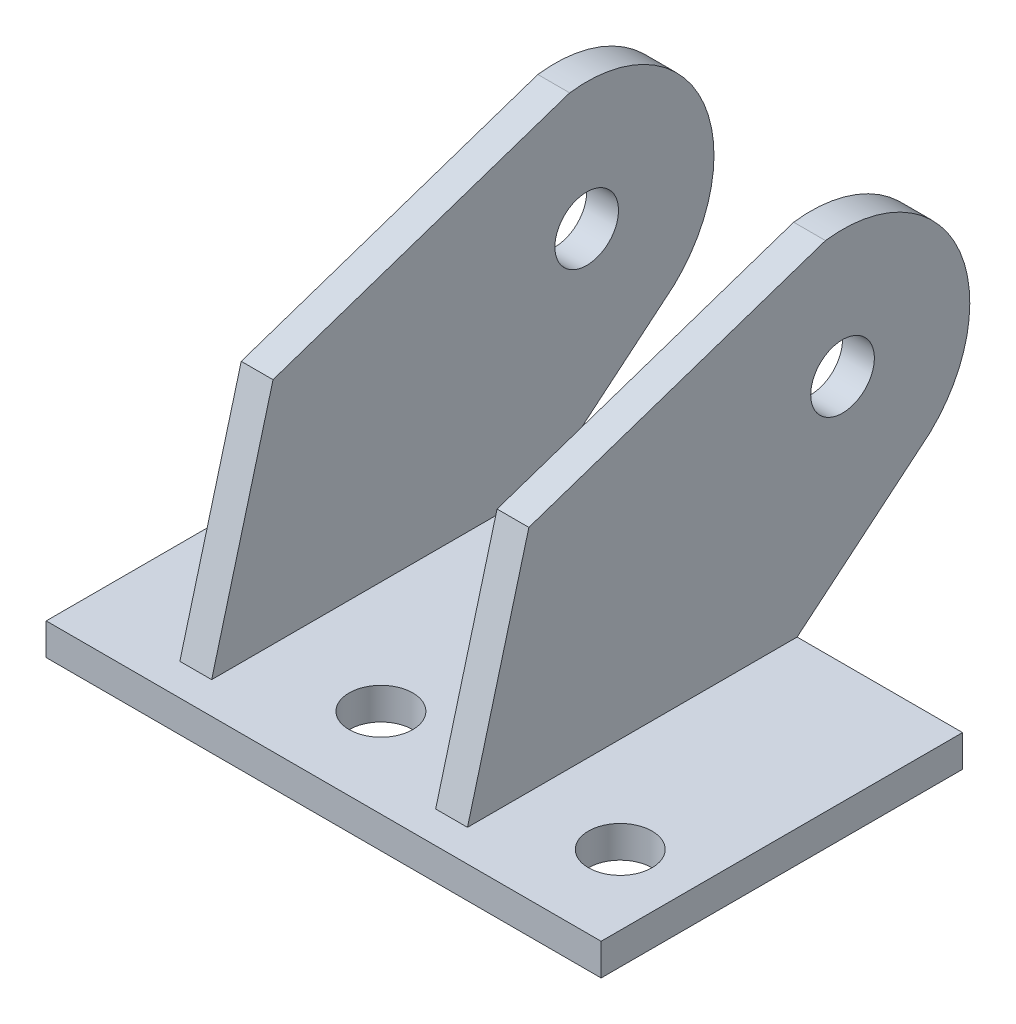
ISO-10303-21;
HEADER;
FILE_DESCRIPTION(('STEP AP214'),'2;1');
FILE_NAME('part.step','',(''),(''),'','','');
FILE_SCHEMA(('AUTOMOTIVE_DESIGN { 1 0 10303 214 1 1 1 1 }'));
ENDSEC;
DATA;
#1=APPLICATION_CONTEXT('core data for automotive mechanical design processes');
#2=APPLICATION_PROTOCOL_DEFINITION('international standard','automotive_design',2000,#1);
#3=PRODUCT_CONTEXT('',#1,'mechanical');
#4=PRODUCT('Part','Part','',(#3));
#5=PRODUCT_RELATED_PRODUCT_CATEGORY('part','',(#4));
#6=PRODUCT_DEFINITION_FORMATION('','',#4);
#7=PRODUCT_DEFINITION_CONTEXT('part definition',#1,'design');
#8=PRODUCT_DEFINITION('design','',#6,#7);
#9=PRODUCT_DEFINITION_SHAPE('','',#8);
#10=(LENGTH_UNIT() NAMED_UNIT(*) SI_UNIT(.MILLI.,.METRE.));
#11=(NAMED_UNIT(*) PLANE_ANGLE_UNIT() SI_UNIT($,.RADIAN.));
#12=(NAMED_UNIT(*) SI_UNIT($,.STERADIAN.) SOLID_ANGLE_UNIT());
#13=UNCERTAINTY_MEASURE_WITH_UNIT(LENGTH_MEASURE(1.E-05),#10,'distance_accuracy_value','');
#14=(GEOMETRIC_REPRESENTATION_CONTEXT(3) GLOBAL_UNCERTAINTY_ASSIGNED_CONTEXT((#13)) GLOBAL_UNIT_ASSIGNED_CONTEXT((#10,
#11,#12)) REPRESENTATION_CONTEXT('',''));
#15=CARTESIAN_POINT('',(0.,0.,0.));
#16=DIRECTION('',(0.,0.,1.));
#17=DIRECTION('',(1.,0.,0.));
#18=AXIS2_PLACEMENT_3D('',#15,#16,#17);
#19=CARTESIAN_POINT('',(0.,3.175,0.));
#20=DIRECTION('',(0.,-1.,0.));
#21=DIRECTION('',(0.,0.,-1.));
#22=AXIS2_PLACEMENT_3D('',#19,#20,#21);
#23=PLANE('',#22);
#24=DIRECTION('',(0.,0.,-1.));
#25=VECTOR('',#24,1.);
#26=CARTESIAN_POINT('',(55.372,3.175,0.));
#27=LINE('',#26,#25);
#28=CARTESIAN_POINT('',(55.372,3.175,0.));
#29=VERTEX_POINT('',#28);
#30=CARTESIAN_POINT('',(55.372,3.175,-36.068));
#31=VERTEX_POINT('',#30);
#32=EDGE_CURVE('E223',#29,#31,#27,.T.);
#33=ORIENTED_EDGE('',*,*,#32,.T.);
#34=DIRECTION('',(-1.,0.,0.));
#35=VECTOR('',#34,1.);
#36=CARTESIAN_POINT('',(0.,3.175,-36.068));
#37=LINE('',#36,#35);
#38=CARTESIAN_POINT('',(38.862,3.175,-36.068));
#39=VERTEX_POINT('',#38);
#40=EDGE_CURVE('E226',#31,#39,#37,.T.);
#41=ORIENTED_EDGE('',*,*,#40,.T.);
#42=DIRECTION('',(0.,0.,-1.));
#43=VECTOR('',#42,1.);
#44=CARTESIAN_POINT('',(38.862,3.175,-3.175));
#45=LINE('',#44,#43);
#46=CARTESIAN_POINT('',(38.862,3.175,-3.175));
#47=VERTEX_POINT('',#46);
#48=EDGE_CURVE('E306',#47,#39,#45,.T.);
#49=ORIENTED_EDGE('',*,*,#48,.F.);
#50=DIRECTION('',(1.,0.,0.));
#51=VECTOR('',#50,1.);
#52=CARTESIAN_POINT('',(35.687,3.175,-3.175));
#53=LINE('',#52,#51);
#54=CARTESIAN_POINT('',(35.687,3.175,-3.175));
#55=VERTEX_POINT('',#54);
#56=EDGE_CURVE('E308',#55,#47,#53,.T.);
#57=ORIENTED_EDGE('',*,*,#56,.F.);
#58=DIRECTION('',(0.,0.,1.));
#59=VECTOR('',#58,1.);
#60=CARTESIAN_POINT('',(35.687,3.175,-3.175));
#61=LINE('',#60,#59);
#62=CARTESIAN_POINT('',(35.687,3.175,-36.068));
#63=VERTEX_POINT('',#62);
#64=EDGE_CURVE('E170',#63,#55,#61,.T.);
#65=ORIENTED_EDGE('',*,*,#64,.F.);
#66=CARTESIAN_POINT('',(13.335,3.175,-36.068));
#67=VERTEX_POINT('',#66);
#68=EDGE_CURVE('E231',#63,#67,#37,.T.);
#69=ORIENTED_EDGE('',*,*,#68,.T.);
#70=DIRECTION('',(0.,0.,-1.));
#71=VECTOR('',#70,1.);
#72=CARTESIAN_POINT('',(13.335,3.175,-3.175));
#73=LINE('',#72,#71);
#74=CARTESIAN_POINT('',(13.335,3.175,-3.175));
#75=VERTEX_POINT('',#74);
#76=EDGE_CURVE('E169',#75,#67,#73,.T.);
#77=ORIENTED_EDGE('',*,*,#76,.F.);
#78=DIRECTION('',(1.,0.,0.));
#79=VECTOR('',#78,1.);
#80=CARTESIAN_POINT('',(10.16,3.175,-3.175));
#81=LINE('',#80,#79);
#82=CARTESIAN_POINT('',(10.16,3.175,-3.175));
#83=VERTEX_POINT('',#82);
#84=EDGE_CURVE('E152',#83,#75,#81,.T.);
#85=ORIENTED_EDGE('',*,*,#84,.F.);
#86=DIRECTION('',(0.,0.,1.));
#87=VECTOR('',#86,1.);
#88=CARTESIAN_POINT('',(10.16,3.175,-3.175));
#89=LINE('',#88,#87);
#90=CARTESIAN_POINT('',(10.16,3.175,-36.068));
#91=VERTEX_POINT('',#90);
#92=EDGE_CURVE('E166',#91,#83,#89,.T.);
#93=ORIENTED_EDGE('',*,*,#92,.F.);
#94=CARTESIAN_POINT('',(0.,3.175,-36.068));
#95=VERTEX_POINT('',#94);
#96=EDGE_CURVE('E225',#91,#95,#37,.T.);
#97=ORIENTED_EDGE('',*,*,#96,.T.);
#98=DIRECTION('',(0.,0.,1.));
#99=VECTOR('',#98,1.);
#100=CARTESIAN_POINT('',(0.,3.175,0.));
#101=LINE('',#100,#99);
#102=CARTESIAN_POINT('',(0.,3.175,0.));
#103=VERTEX_POINT('',#102);
#104=EDGE_CURVE('E216',#95,#103,#101,.T.);
#105=ORIENTED_EDGE('',*,*,#104,.T.);
#106=DIRECTION('',(1.,0.,0.));
#107=VECTOR('',#106,1.);
#108=CARTESIAN_POINT('',(0.,3.175,0.));
#109=LINE('',#108,#107);
#110=EDGE_CURVE('E219',#103,#29,#109,.T.);
#111=ORIENTED_EDGE('',*,*,#110,.T.);
#112=EDGE_LOOP('',(#33,#41,#49,#57,#65,#69,#77,#85,#93,#97,#105,#111));
#113=FACE_BOUND('',#112,.T.);
#114=CARTESIAN_POINT('',(24.511,3.175,-26.162));
#115=DIRECTION('',(0.,1.,0.));
#116=DIRECTION('',(0.,0.,1.));
#117=AXIS2_PLACEMENT_3D('',#114,#115,#116);
#118=CIRCLE('',#117,3.175);
#119=CARTESIAN_POINT('',(24.511,3.175,-22.987));
#120=VERTEX_POINT('',#119);
#121=EDGE_CURVE('E200',#120,#120,#118,.T.);
#122=ORIENTED_EDGE('',*,*,#121,.F.);
#123=EDGE_LOOP('',(#122));
#124=FACE_BOUND('',#123,.T.);
#125=CARTESIAN_POINT('',(24.511,3.175,-8.89));
#126=DIRECTION('',(0.,1.,0.));
#127=DIRECTION('',(0.,0.,1.));
#128=AXIS2_PLACEMENT_3D('',#125,#126,#127);
#129=CIRCLE('',#128,3.175);
#130=CARTESIAN_POINT('',(24.511,3.175,-5.715));
#131=VERTEX_POINT('',#130);
#132=EDGE_CURVE('E208',#131,#131,#129,.T.);
#133=ORIENTED_EDGE('',*,*,#132,.F.);
#134=EDGE_LOOP('',(#133));
#135=FACE_BOUND('',#134,.T.);
#136=CARTESIAN_POINT('',(48.387,3.175,-8.89));
#137=DIRECTION('',(0.,1.,0.));
#138=DIRECTION('',(0.,0.,1.));
#139=AXIS2_PLACEMENT_3D('',#136,#137,#138);
#140=CIRCLE('',#139,3.175);
#141=CARTESIAN_POINT('',(48.387,3.175,-5.715));
#142=VERTEX_POINT('',#141);
#143=EDGE_CURVE('E190',#142,#142,#140,.T.);
#144=ORIENTED_EDGE('',*,*,#143,.F.);
#145=EDGE_LOOP('',(#144));
#146=FACE_BOUND('',#145,.T.);
#147=ADVANCED_FACE('F48',(#113,#124,#135,#146),#23,.F.);
#148=CARTESIAN_POINT('',(0.,0.,0.));
#149=DIRECTION('',(0.,-1.,0.));
#150=DIRECTION('',(0.,0.,-1.));
#151=AXIS2_PLACEMENT_3D('',#148,#149,#150);
#152=PLANE('',#151);
#153=CARTESIAN_POINT('',(24.511,0.,-26.162));
#154=DIRECTION('',(0.,1.,0.));
#155=DIRECTION('',(0.,0.,1.));
#156=AXIS2_PLACEMENT_3D('',#153,#154,#155);
#157=CIRCLE('',#156,3.175);
#158=CARTESIAN_POINT('',(24.511,0.,-22.987));
#159=VERTEX_POINT('',#158);
#160=EDGE_CURVE('E195',#159,#159,#157,.T.);
#161=ORIENTED_EDGE('',*,*,#160,.T.);
#162=EDGE_LOOP('',(#161));
#163=FACE_BOUND('',#162,.T.);
#164=DIRECTION('',(0.,0.,1.));
#165=VECTOR('',#164,1.);
#166=CARTESIAN_POINT('',(0.,0.,0.));
#167=LINE('',#166,#165);
#168=CARTESIAN_POINT('',(0.,0.,-36.068));
#169=VERTEX_POINT('',#168);
#170=CARTESIAN_POINT('',(0.,0.,0.));
#171=VERTEX_POINT('',#170);
#172=EDGE_CURVE('E213',#169,#171,#167,.T.);
#173=ORIENTED_EDGE('',*,*,#172,.F.);
#174=DIRECTION('',(-1.,0.,0.));
#175=VECTOR('',#174,1.);
#176=CARTESIAN_POINT('',(0.,0.,-36.068));
#177=LINE('',#176,#175);
#178=CARTESIAN_POINT('',(55.372,0.,-36.068));
#179=VERTEX_POINT('',#178);
#180=EDGE_CURVE('E220',#179,#169,#177,.T.);
#181=ORIENTED_EDGE('',*,*,#180,.F.);
#182=DIRECTION('',(0.,0.,-1.));
#183=VECTOR('',#182,1.);
#184=CARTESIAN_POINT('',(55.372,0.,0.));
#185=LINE('',#184,#183);
#186=CARTESIAN_POINT('',(55.372,0.,0.));
#187=VERTEX_POINT('',#186);
#188=EDGE_CURVE('E237',#187,#179,#185,.T.);
#189=ORIENTED_EDGE('',*,*,#188,.F.);
#190=DIRECTION('',(1.,0.,0.));
#191=VECTOR('',#190,1.);
#192=CARTESIAN_POINT('',(0.,0.,0.));
#193=LINE('',#192,#191);
#194=EDGE_CURVE('E235',#171,#187,#193,.T.);
#195=ORIENTED_EDGE('',*,*,#194,.F.);
#196=EDGE_LOOP('',(#173,#181,#189,#195));
#197=FACE_BOUND('',#196,.T.);
#198=CARTESIAN_POINT('',(24.511,0.,-8.89));
#199=DIRECTION('',(0.,1.,0.));
#200=DIRECTION('',(0.,0.,1.));
#201=AXIS2_PLACEMENT_3D('',#198,#199,#200);
#202=CIRCLE('',#201,3.175);
#203=CARTESIAN_POINT('',(24.511,0.,-5.715));
#204=VERTEX_POINT('',#203);
#205=EDGE_CURVE('E204',#204,#204,#202,.T.);
#206=ORIENTED_EDGE('',*,*,#205,.T.);
#207=EDGE_LOOP('',(#206));
#208=FACE_BOUND('',#207,.T.);
#209=CARTESIAN_POINT('',(48.387,0.,-8.89));
#210=DIRECTION('',(0.,1.,0.));
#211=DIRECTION('',(0.,0.,1.));
#212=AXIS2_PLACEMENT_3D('',#209,#210,#211);
#213=CIRCLE('',#212,3.175);
#214=CARTESIAN_POINT('',(48.387,0.,-5.715));
#215=VERTEX_POINT('',#214);
#216=EDGE_CURVE('E189',#215,#215,#213,.T.);
#217=ORIENTED_EDGE('',*,*,#216,.T.);
#218=EDGE_LOOP('',(#217));
#219=FACE_BOUND('',#218,.T.);
#220=ADVANCED_FACE('F345',(#163,#197,#208,#219),#152,.T.);
#221=CARTESIAN_POINT('',(0.,3.175,0.));
#222=DIRECTION('',(1.,0.,0.));
#223=DIRECTION('',(0.,0.,-1.));
#224=AXIS2_PLACEMENT_3D('',#221,#222,#223);
#225=PLANE('',#224);
#226=ORIENTED_EDGE('',*,*,#172,.T.);
#227=DIRECTION('',(0.,-1.,0.));
#228=VECTOR('',#227,1.);
#229=CARTESIAN_POINT('',(0.,3.175,0.));
#230=LINE('',#229,#228);
#231=EDGE_CURVE('E177',#103,#171,#230,.T.);
#232=ORIENTED_EDGE('',*,*,#231,.F.);
#233=ORIENTED_EDGE('',*,*,#104,.F.);
#234=DIRECTION('',(0.,-1.,0.));
#235=VECTOR('',#234,1.);
#236=CARTESIAN_POINT('',(0.,3.175,-36.068));
#237=LINE('',#236,#235);
#238=EDGE_CURVE('E229',#95,#169,#237,.T.);
#239=ORIENTED_EDGE('',*,*,#238,.T.);
#240=EDGE_LOOP('',(#226,#232,#233,#239));
#241=FACE_BOUND('',#240,.T.);
#242=ADVANCED_FACE('F50',(#241),#225,.F.);
#243=CARTESIAN_POINT('',(0.,3.175,0.));
#244=DIRECTION('',(0.,0.,-1.));
#245=DIRECTION('',(-1.,0.,0.));
#246=AXIS2_PLACEMENT_3D('',#243,#244,#245);
#247=PLANE('',#246);
#248=ORIENTED_EDGE('',*,*,#194,.T.);
#249=DIRECTION('',(0.,-1.,0.));
#250=VECTOR('',#249,1.);
#251=CARTESIAN_POINT('',(55.372,3.175,0.));
#252=LINE('',#251,#250);
#253=EDGE_CURVE('E183',#29,#187,#252,.T.);
#254=ORIENTED_EDGE('',*,*,#253,.F.);
#255=ORIENTED_EDGE('',*,*,#110,.F.);
#256=ORIENTED_EDGE('',*,*,#231,.T.);
#257=EDGE_LOOP('',(#248,#254,#255,#256));
#258=FACE_BOUND('',#257,.T.);
#259=ADVANCED_FACE('F361',(#258),#247,.F.);
#260=CARTESIAN_POINT('',(55.372,3.175,0.));
#261=DIRECTION('',(-1.,0.,0.));
#262=DIRECTION('',(0.,0.,1.));
#263=AXIS2_PLACEMENT_3D('',#260,#261,#262);
#264=PLANE('',#263);
#265=ORIENTED_EDGE('',*,*,#188,.T.);
#266=DIRECTION('',(0.,-1.,0.));
#267=VECTOR('',#266,1.);
#268=CARTESIAN_POINT('',(55.372,3.175,-36.068));
#269=LINE('',#268,#267);
#270=EDGE_CURVE('E242',#31,#179,#269,.T.);
#271=ORIENTED_EDGE('',*,*,#270,.F.);
#272=ORIENTED_EDGE('',*,*,#32,.F.);
#273=ORIENTED_EDGE('',*,*,#253,.T.);
#274=EDGE_LOOP('',(#265,#271,#272,#273));
#275=FACE_BOUND('',#274,.T.);
#276=ADVANCED_FACE('F360',(#275),#264,.F.);
#277=CARTESIAN_POINT('',(0.,3.175,-36.068));
#278=DIRECTION('',(0.,0.,1.));
#279=DIRECTION('',(1.,0.,0.));
#280=AXIS2_PLACEMENT_3D('',#277,#278,#279);
#281=PLANE('',#280);
#282=ORIENTED_EDGE('',*,*,#180,.T.);
#283=ORIENTED_EDGE('',*,*,#238,.F.);
#284=ORIENTED_EDGE('',*,*,#96,.F.);
#285=EDGE_CURVE('E232',#67,#91,#37,.T.);
#286=ORIENTED_EDGE('',*,*,#285,.F.);
#287=ORIENTED_EDGE('',*,*,#68,.F.);
#288=EDGE_CURVE('E230',#39,#63,#37,.T.);
#289=ORIENTED_EDGE('',*,*,#288,.F.);
#290=ORIENTED_EDGE('',*,*,#40,.F.);
#291=ORIENTED_EDGE('',*,*,#270,.T.);
#292=EDGE_LOOP('',(#282,#283,#284,#286,#287,#289,#290,#291));
#293=FACE_BOUND('',#292,.T.);
#294=ADVANCED_FACE('F321',(#293),#281,.F.);
#295=CARTESIAN_POINT('',(24.511,3.175,-8.89));
#296=DIRECTION('',(0.,-1.,0.));
#297=DIRECTION('',(0.,0.,-1.));
#298=AXIS2_PLACEMENT_3D('',#295,#296,#297);
#299=CYLINDRICAL_SURFACE('',#298,3.175);
#300=ORIENTED_EDGE('',*,*,#132,.T.);
#301=EDGE_LOOP('',(#300));
#302=FACE_BOUND('',#301,.T.);
#303=ORIENTED_EDGE('',*,*,#205,.F.);
#304=EDGE_LOOP('',(#303));
#305=FACE_BOUND('',#304,.T.);
#306=ADVANCED_FACE('F355',(#302,#305),#299,.F.);
#307=CARTESIAN_POINT('',(24.511,3.175,-26.162));
#308=DIRECTION('',(0.,-1.,0.));
#309=DIRECTION('',(0.,0.,-1.));
#310=AXIS2_PLACEMENT_3D('',#307,#308,#309);
#311=CYLINDRICAL_SURFACE('',#310,3.175);
#312=ORIENTED_EDGE('',*,*,#121,.T.);
#313=EDGE_LOOP('',(#312));
#314=FACE_BOUND('',#313,.T.);
#315=ORIENTED_EDGE('',*,*,#160,.F.);
#316=EDGE_LOOP('',(#315));
#317=FACE_BOUND('',#316,.T.);
#318=ADVANCED_FACE('F387',(#314,#317),#311,.F.);
#319=CARTESIAN_POINT('',(48.387,3.175,-8.89));
#320=DIRECTION('',(0.,-1.,0.));
#321=DIRECTION('',(0.,0.,-1.));
#322=AXIS2_PLACEMENT_3D('',#319,#320,#321);
#323=CYLINDRICAL_SURFACE('',#322,3.175);
#324=ORIENTED_EDGE('',*,*,#143,.T.);
#325=EDGE_LOOP('',(#324));
#326=FACE_BOUND('',#325,.T.);
#327=ORIENTED_EDGE('',*,*,#216,.F.);
#328=EDGE_LOOP('',(#327));
#329=FACE_BOUND('',#328,.T.);
#330=ADVANCED_FACE('F385',(#326,#329),#323,.F.);
#331=CARTESIAN_POINT('',(10.16,41.275,-3.175));
#332=DIRECTION('',(1.,0.,0.));
#333=DIRECTION('',(0.,0.,-1.));
#334=AXIS2_PLACEMENT_3D('',#331,#332,#333);
#335=PLANE('',#334);
#336=CARTESIAN_POINT('',(10.16,23.4355448586214,-40.5975082426515));
#337=DIRECTION('',(-1.,0.,0.));
#338=DIRECTION('',(0.,0.,1.));
#339=AXIS2_PLACEMENT_3D('',#336,#337,#338);
#340=CIRCLE('',#339,3.175);
#341=CARTESIAN_POINT('',(10.16,23.4355448586214,-37.4225082426515));
#342=VERTEX_POINT('',#341);
#343=EDGE_CURVE('E294',#342,#342,#340,.T.);
#344=ORIENTED_EDGE('',*,*,#343,.F.);
#345=EDGE_LOOP('',(#344));
#346=FACE_BOUND('',#345,.T.);
#347=ORIENTED_EDGE('',*,*,#92,.T.);
#348=DIRECTION('',(0.,-0.965925826289068,0.258819045102522));
#349=VECTOR('',#348,1.);
#350=CARTESIAN_POINT('',(10.16,3.175,-3.175));
#351=LINE('',#350,#349);
#352=CARTESIAN_POINT('',(10.16,26.035,-9.30031853897549));
#353=VERTEX_POINT('',#352);
#354=EDGE_CURVE('E149',#353,#83,#351,.T.);
#355=ORIENTED_EDGE('',*,*,#354,.F.);
#356=DIRECTION('',(0.,-0.319693709258279,0.947520940275561));
#357=VECTOR('',#356,1.);
#358=CARTESIAN_POINT('',(10.16,26.035,-9.30031853897549));
#359=LINE('',#358,#357);
#360=CARTESIAN_POINT('',(10.16,36.0213542971487,-38.8982728919485));
#361=VERTEX_POINT('',#360);
#362=EDGE_CURVE('E274',#361,#353,#359,.T.);
#363=ORIENTED_EDGE('',*,*,#362,.F.);
#364=CARTESIAN_POINT('',(10.16,23.4355448586214,-40.5975082426515));
#365=DIRECTION('',(1.,0.,0.));
#366=DIRECTION('',(0.,0.,1.));
#367=AXIS2_PLACEMENT_3D('',#364,#365,#366);
#368=CIRCLE('',#367,12.7);
#369=CARTESIAN_POINT('',(10.16,14.2257191361848,-49.3421700521411));
#370=VERTEX_POINT('',#369);
#371=EDGE_CURVE('E330',#370,#361,#368,.T.);
#372=ORIENTED_EDGE('',*,*,#371,.F.);
#373=DIRECTION('',(0.,0.639805415480825,-0.768536941416227));
#374=VECTOR('',#373,1.);
#375=CARTESIAN_POINT('',(10.16,3.175,-36.068));
#376=LINE('',#375,#374);
#377=EDGE_CURVE('E160',#91,#370,#376,.T.);
#378=ORIENTED_EDGE('',*,*,#377,.F.);
#379=EDGE_LOOP('',(#347,#355,#363,#372,#378));
#380=FACE_BOUND('',#379,.T.);
#381=ADVANCED_FACE('F173',(#346,#380),#335,.F.);
#382=CARTESIAN_POINT('',(13.335,41.275,-3.175));
#383=DIRECTION('',(-1.,0.,0.));
#384=DIRECTION('',(0.,0.,1.));
#385=AXIS2_PLACEMENT_3D('',#382,#383,#384);
#386=PLANE('',#385);
#387=CARTESIAN_POINT('',(13.335,23.4355448586214,-40.5975082426515));
#388=DIRECTION('',(-1.,0.,0.));
#389=DIRECTION('',(0.,0.,1.));
#390=AXIS2_PLACEMENT_3D('',#387,#388,#389);
#391=CIRCLE('',#390,3.175);
#392=CARTESIAN_POINT('',(13.335,23.4355448586214,-37.4225082426515));
#393=VERTEX_POINT('',#392);
#394=EDGE_CURVE('E303',#393,#393,#391,.T.);
#395=ORIENTED_EDGE('',*,*,#394,.T.);
#396=EDGE_LOOP('',(#395));
#397=FACE_BOUND('',#396,.T.);
#398=DIRECTION('',(0.,-0.31969370925828,0.947520940275561));
#399=VECTOR('',#398,1.);
#400=CARTESIAN_POINT('',(13.335,25.7371300371616,-8.41747968699033));
#401=LINE('',#400,#399);
#402=CARTESIAN_POINT('',(13.335,36.0213542971487,-38.8982728919485));
#403=VERTEX_POINT('',#402);
#404=CARTESIAN_POINT('',(13.335,26.035,-9.30031853897549));
#405=VERTEX_POINT('',#404);
#406=EDGE_CURVE('E286',#403,#405,#401,.T.);
#407=ORIENTED_EDGE('',*,*,#406,.T.);
#408=DIRECTION('',(0.,-0.965925826289068,0.258819045102522));
#409=VECTOR('',#408,1.);
#410=CARTESIAN_POINT('',(13.335,38.7227839420935,-12.7));
#411=LINE('',#410,#409);
#412=EDGE_CURVE('E292',#405,#75,#411,.T.);
#413=ORIENTED_EDGE('',*,*,#412,.T.);
#414=ORIENTED_EDGE('',*,*,#76,.T.);
#415=DIRECTION('',(0.,0.639805415480825,-0.768536941416227));
#416=VECTOR('',#415,1.);
#417=CARTESIAN_POINT('',(13.335,2.59732014834499,-35.3740885457259));
#418=LINE('',#417,#416);
#419=CARTESIAN_POINT('',(13.335,14.2257191361848,-49.3421700521411));
#420=VERTEX_POINT('',#419);
#421=EDGE_CURVE('E71',#67,#420,#418,.T.);
#422=ORIENTED_EDGE('',*,*,#421,.T.);
#423=CARTESIAN_POINT('',(13.335,23.4355448586214,-40.5975082426515));
#424=DIRECTION('',(-1.,0.,0.));
#425=DIRECTION('',(0.,0.,1.));
#426=AXIS2_PLACEMENT_3D('',#423,#424,#425);
#427=CIRCLE('',#426,12.7);
#428=EDGE_CURVE('E281',#420,#403,#427,.F.);
#429=ORIENTED_EDGE('',*,*,#428,.T.);
#430=EDGE_LOOP('',(#407,#413,#414,#422,#429));
#431=FACE_BOUND('',#430,.T.);
#432=ADVANCED_FACE('F325',(#397,#431),#386,.F.);
#433=CARTESIAN_POINT('',(35.687,41.275,-3.175));
#434=DIRECTION('',(1.,0.,0.));
#435=DIRECTION('',(0.,0.,-1.));
#436=AXIS2_PLACEMENT_3D('',#433,#434,#435);
#437=PLANE('',#436);
#438=CARTESIAN_POINT('',(35.687,23.4355448586214,-40.5975082426515));
#439=DIRECTION('',(1.,0.,0.));
#440=DIRECTION('',(0.,0.,-1.));
#441=AXIS2_PLACEMENT_3D('',#438,#439,#440);
#442=CIRCLE('',#441,3.175);
#443=CARTESIAN_POINT('',(35.687,23.4355448586214,-37.4225082426515));
#444=VERTEX_POINT('',#443);
#445=EDGE_CURVE('E300',#444,#444,#442,.T.);
#446=ORIENTED_EDGE('',*,*,#445,.T.);
#447=EDGE_LOOP('',(#446));
#448=FACE_BOUND('',#447,.T.);
#449=ORIENTED_EDGE('',*,*,#64,.T.);
#450=DIRECTION('',(0.,0.965925826289068,-0.258819045102522));
#451=VECTOR('',#450,1.);
#452=CARTESIAN_POINT('',(35.687,38.7227839420935,-12.7));
#453=LINE('',#452,#451);
#454=CARTESIAN_POINT('',(35.687,26.035,-9.30031853897549));
#455=VERTEX_POINT('',#454);
#456=EDGE_CURVE('E289',#55,#455,#453,.T.);
#457=ORIENTED_EDGE('',*,*,#456,.T.);
#458=DIRECTION('',(0.,0.31969370925828,-0.947520940275561));
#459=VECTOR('',#458,1.);
#460=CARTESIAN_POINT('',(35.687,25.7371300371616,-8.41747968699033));
#461=LINE('',#460,#459);
#462=CARTESIAN_POINT('',(35.687,36.0213542971487,-38.8982728919485));
#463=VERTEX_POINT('',#462);
#464=EDGE_CURVE('E284',#455,#463,#461,.T.);
#465=ORIENTED_EDGE('',*,*,#464,.T.);
#466=CARTESIAN_POINT('',(35.687,23.4355448586214,-40.5975082426515));
#467=DIRECTION('',(1.,0.,0.));
#468=DIRECTION('',(0.,0.,-1.));
#469=AXIS2_PLACEMENT_3D('',#466,#467,#468);
#470=CIRCLE('',#469,12.7);
#471=CARTESIAN_POINT('',(35.687,14.2257191361848,-49.3421700521411));
#472=VERTEX_POINT('',#471);
#473=EDGE_CURVE('E266',#463,#472,#470,.F.);
#474=ORIENTED_EDGE('',*,*,#473,.T.);
#475=DIRECTION('',(0.,-0.639805415480825,0.768536941416227));
#476=VECTOR('',#475,1.);
#477=CARTESIAN_POINT('',(35.687,2.59732014834499,-35.3740885457259));
#478=LINE('',#477,#476);
#479=EDGE_CURVE('E275',#472,#63,#478,.T.);
#480=ORIENTED_EDGE('',*,*,#479,.T.);
#481=EDGE_LOOP('',(#449,#457,#465,#474,#480));
#482=FACE_BOUND('',#481,.T.);
#483=ADVANCED_FACE('F314',(#448,#482),#437,.F.);
#484=CARTESIAN_POINT('',(38.862,41.275,-3.175));
#485=DIRECTION('',(-1.,0.,0.));
#486=DIRECTION('',(0.,0.,1.));
#487=AXIS2_PLACEMENT_3D('',#484,#485,#486);
#488=PLANE('',#487);
#489=CARTESIAN_POINT('',(38.862,23.4355448586214,-40.5975082426515));
#490=DIRECTION('',(-1.,0.,0.));
#491=DIRECTION('',(0.,0.,1.));
#492=AXIS2_PLACEMENT_3D('',#489,#490,#491);
#493=CIRCLE('',#492,3.175);
#494=CARTESIAN_POINT('',(38.862,23.4355448586214,-37.4225082426515));
#495=VERTEX_POINT('',#494);
#496=EDGE_CURVE('E297',#495,#495,#493,.F.);
#497=ORIENTED_EDGE('',*,*,#496,.F.);
#498=EDGE_LOOP('',(#497));
#499=FACE_BOUND('',#498,.T.);
#500=DIRECTION('',(0.,-0.31969370925828,0.947520940275561));
#501=VECTOR('',#500,1.);
#502=CARTESIAN_POINT('',(38.862,25.7371300371616,-8.41747968699033));
#503=LINE('',#502,#501);
#504=CARTESIAN_POINT('',(38.862,36.0213542971487,-38.8982728919485));
#505=VERTEX_POINT('',#504);
#506=CARTESIAN_POINT('',(38.862,26.035,-9.30031853897549));
#507=VERTEX_POINT('',#506);
#508=EDGE_CURVE('E56',#505,#507,#503,.T.);
#509=ORIENTED_EDGE('',*,*,#508,.T.);
#510=DIRECTION('',(0.,-0.965925826289068,0.258819045102522));
#511=VECTOR('',#510,1.);
#512=CARTESIAN_POINT('',(38.862,38.7227839420935,-12.7));
#513=LINE('',#512,#511);
#514=EDGE_CURVE('E12',#507,#47,#513,.T.);
#515=ORIENTED_EDGE('',*,*,#514,.T.);
#516=ORIENTED_EDGE('',*,*,#48,.T.);
#517=DIRECTION('',(0.,0.639805415480825,-0.768536941416227));
#518=VECTOR('',#517,1.);
#519=CARTESIAN_POINT('',(38.862,2.59732014834499,-35.3740885457259));
#520=LINE('',#519,#518);
#521=CARTESIAN_POINT('',(38.862,14.2257191361848,-49.3421700521411));
#522=VERTEX_POINT('',#521);
#523=EDGE_CURVE('E176',#39,#522,#520,.T.);
#524=ORIENTED_EDGE('',*,*,#523,.T.);
#525=CARTESIAN_POINT('',(38.862,23.4355448586214,-40.5975082426515));
#526=DIRECTION('',(-1.,0.,0.));
#527=DIRECTION('',(0.,0.,1.));
#528=AXIS2_PLACEMENT_3D('',#525,#526,#527);
#529=CIRCLE('',#528,12.7);
#530=EDGE_CURVE('E180',#522,#505,#529,.F.);
#531=ORIENTED_EDGE('',*,*,#530,.T.);
#532=EDGE_LOOP('',(#509,#515,#516,#524,#531));
#533=FACE_BOUND('',#532,.T.);
#534=ADVANCED_FACE('F251',(#499,#533),#488,.F.);
#535=CARTESIAN_POINT('',(47.8422561210691,23.4355448586214,-40.5975082426515));
#536=DIRECTION('',(-1.,0.,0.));
#537=DIRECTION('',(0.,0.,1.));
#538=AXIS2_PLACEMENT_3D('',#535,#536,#537);
#539=CYLINDRICAL_SURFACE('',#538,3.175);
#540=CARTESIAN_POINT('',(38.862,23.4355448586214,-37.4225082426515));
#541=CARTESIAN_POINT('',(38.8289270833333,23.4355448586214,-37.4225082426515));
#542=CARTESIAN_POINT('',(38.7958541666667,23.4355448586214,-37.4225082426515));
#543=CARTESIAN_POINT('',(38.7297083333333,23.4355448586214,-37.4225082426515));
#544=CARTESIAN_POINT('',(38.6966354166667,23.4355448586214,-37.4225082426515));
#545=CARTESIAN_POINT('',(38.6304895833333,23.4355448586214,-37.4225082426515));
#546=CARTESIAN_POINT('',(38.5974166666667,23.4355448586214,-37.4225082426515));
#547=CARTESIAN_POINT('',(38.5312708333333,23.4355448586214,-37.4225082426515));
#548=CARTESIAN_POINT('',(38.4981979166667,23.4355448586214,-37.4225082426515));
#549=CARTESIAN_POINT('',(38.4320520833333,23.4355448586214,-37.4225082426515));
#550=CARTESIAN_POINT('',(38.3989791666667,23.4355448586214,-37.4225082426515));
#551=CARTESIAN_POINT('',(38.3328333333333,23.4355448586214,-37.4225082426515));
#552=CARTESIAN_POINT('',(38.2997604166667,23.4355448586214,-37.4225082426515));
#553=CARTESIAN_POINT('',(38.2336145833333,23.4355448586214,-37.4225082426515));
#554=CARTESIAN_POINT('',(38.2005416666667,23.4355448586214,-37.4225082426515));
#555=CARTESIAN_POINT('',(38.1343958333333,23.4355448586214,-37.4225082426515));
#556=CARTESIAN_POINT('',(38.1013229166667,23.4355448586214,-37.4225082426515));
#557=CARTESIAN_POINT('',(38.0351770833333,23.4355448586214,-37.4225082426515));
#558=CARTESIAN_POINT('',(38.0021041666667,23.4355448586214,-37.4225082426515));
#559=CARTESIAN_POINT('',(37.9359583333333,23.4355448586214,-37.4225082426515));
#560=CARTESIAN_POINT('',(37.9028854166667,23.4355448586214,-37.4225082426515));
#561=CARTESIAN_POINT('',(37.8367395833333,23.4355448586214,-37.4225082426515));
#562=CARTESIAN_POINT('',(37.8036666666667,23.4355448586214,-37.4225082426515));
#563=CARTESIAN_POINT('',(37.7375208333333,23.4355448586214,-37.4225082426515));
#564=CARTESIAN_POINT('',(37.7044479166667,23.4355448586214,-37.4225082426515));
#565=CARTESIAN_POINT('',(37.6383020833333,23.4355448586214,-37.4225082426515));
#566=CARTESIAN_POINT('',(37.6052291666667,23.4355448586214,-37.4225082426515));
#567=CARTESIAN_POINT('',(37.5390833333333,23.4355448586214,-37.4225082426515));
#568=CARTESIAN_POINT('',(37.5060104166667,23.4355448586214,-37.4225082426515));
#569=CARTESIAN_POINT('',(37.4398645833333,23.4355448586214,-37.4225082426515));
#570=CARTESIAN_POINT('',(37.4067916666667,23.4355448586214,-37.4225082426515));
#571=CARTESIAN_POINT('',(37.3406458333333,23.4355448586214,-37.4225082426515));
#572=CARTESIAN_POINT('',(37.3075729166667,23.4355448586214,-37.4225082426515));
#573=CARTESIAN_POINT('',(37.2414270833333,23.4355448586214,-37.4225082426515));
#574=CARTESIAN_POINT('',(37.2083541666667,23.4355448586214,-37.4225082426515));
#575=CARTESIAN_POINT('',(37.1422083333333,23.4355448586214,-37.4225082426515));
#576=CARTESIAN_POINT('',(37.1091354166667,23.4355448586214,-37.4225082426515));
#577=CARTESIAN_POINT('',(37.0429895833333,23.4355448586214,-37.4225082426515));
#578=CARTESIAN_POINT('',(37.0099166666667,23.4355448586214,-37.4225082426515));
#579=CARTESIAN_POINT('',(36.9437708333333,23.4355448586214,-37.4225082426515));
#580=CARTESIAN_POINT('',(36.9106979166667,23.4355448586214,-37.4225082426515));
#581=CARTESIAN_POINT('',(36.8445520833333,23.4355448586214,-37.4225082426515));
#582=CARTESIAN_POINT('',(36.8114791666667,23.4355448586214,-37.4225082426515));
#583=CARTESIAN_POINT('',(36.7453333333333,23.4355448586214,-37.4225082426515));
#584=CARTESIAN_POINT('',(36.7122604166667,23.4355448586214,-37.4225082426515));
#585=CARTESIAN_POINT('',(36.6461145833333,23.4355448586214,-37.4225082426515));
#586=CARTESIAN_POINT('',(36.6130416666667,23.4355448586214,-37.4225082426515));
#587=CARTESIAN_POINT('',(36.5468958333333,23.4355448586214,-37.4225082426515));
#588=CARTESIAN_POINT('',(36.5138229166667,23.4355448586214,-37.4225082426515));
#589=CARTESIAN_POINT('',(36.4476770833333,23.4355448586214,-37.4225082426515));
#590=CARTESIAN_POINT('',(36.4146041666667,23.4355448586214,-37.4225082426515));
#591=CARTESIAN_POINT('',(36.3484583333333,23.4355448586214,-37.4225082426515));
#592=CARTESIAN_POINT('',(36.3153854166667,23.4355448586214,-37.4225082426515));
#593=CARTESIAN_POINT('',(36.2492395833333,23.4355448586214,-37.4225082426515));
#594=CARTESIAN_POINT('',(36.2161666666667,23.4355448586214,-37.4225082426515));
#595=CARTESIAN_POINT('',(36.1500208333333,23.4355448586214,-37.4225082426515));
#596=CARTESIAN_POINT('',(36.1169479166667,23.4355448586214,-37.4225082426515));
#597=CARTESIAN_POINT('',(36.0508020833333,23.4355448586214,-37.4225082426515));
#598=CARTESIAN_POINT('',(36.0177291666667,23.4355448586214,-37.4225082426515));
#599=CARTESIAN_POINT('',(35.9515833333333,23.4355448586214,-37.4225082426515));
#600=CARTESIAN_POINT('',(35.9185104166667,23.4355448586214,-37.4225082426515));
#601=CARTESIAN_POINT('',(35.8523645833333,23.4355448586214,-37.4225082426515));
#602=CARTESIAN_POINT('',(35.8192916666667,23.4355448586214,-37.4225082426515));
#603=CARTESIAN_POINT('',(35.7531458333333,23.4355448586214,-37.4225082426515));
#604=CARTESIAN_POINT('',(35.7200729166667,23.4355448586214,-37.4225082426515));
#605=CARTESIAN_POINT('',(35.687,23.4355448586214,-37.4225082426515));
#606=B_SPLINE_CURVE_WITH_KNOTS('',3,(#540,#541,#542,#543,#544,#545,#546,#547,#548,#549,#550,
#551,#552,#553,#554,#555,#556,#557,#558,#559,#560,#561,#562,#563,#564,#565,#566,#567,#568,#569,
#570,#571,#572,#573,#574,#575,#576,#577,#578,#579,#580,#581,#582,#583,#584,#585,#586,#587,#588,
#589,#590,#591,#592,#593,#594,#595,#596,#597,#598,#599,#600,#601,#602,#603,#604,#605),
.UNSPECIFIED.,.F.,.F.,(4,2,2,2,2,2,2,2,2,2,2,2,2,2,2,2,2,2,2,2,2,2,2,2,2,2,2,2,2,2,2,2,4),(0.,
0.0992187500000047,0.198437500000002,0.29765625,0.396875000000005,0.496093750000003,0.5953125,
0.694531250000005,0.793750000000003,0.892968750000001,0.992187500000005,1.09140625,1.190625,
1.28984375000001,1.3890625,1.48828125000001,1.58750000000001,1.68671875,1.78593750000001,
1.88515625000001,1.98437500000001,2.08359375000001,2.18281250000001,2.28203125000001,
2.38125000000001,2.48046875000001,2.57968750000001,2.67890625000001,2.77812500000001,
2.87734375000001,2.97656250000001,3.07578125000001,3.17500000000001),.UNSPECIFIED.);
#607=EDGE_CURVE('BSEAM404',#495,#444,#606,.T.);
#608=ORIENTED_EDGE('',*,*,#496,.T.);
#609=ORIENTED_EDGE('',*,*,#445,.F.);
#610=ORIENTED_EDGE('',*,*,#607,.T.);
#611=ORIENTED_EDGE('',*,*,#607,.F.);
#612=EDGE_LOOP('',(#608,#610,#609,#611));
#613=FACE_BOUND('',#612,.T.);
#614=ADVANCED_FACE('F404',(#613),#539,.F.);
#615=ORIENTED_EDGE('',*,*,#343,.T.);
#616=EDGE_LOOP('',(#615));
#617=FACE_BOUND('',#616,.T.);
#618=ORIENTED_EDGE('',*,*,#394,.F.);
#619=EDGE_LOOP('',(#618));
#620=FACE_BOUND('',#619,.T.);
#621=ADVANCED_FACE('F409',(#617,#620),#539,.F.);
#622=CARTESIAN_POINT('',(55.372,3.175,-36.068));
#623=DIRECTION('',(0.,0.768536941416227,0.639805415480825));
#624=DIRECTION('',(0.,-0.639805415480825,0.768536941416227));
#625=AXIS2_PLACEMENT_3D('',#622,#623,#624);
#626=PLANE('',#625);
#627=DIRECTION('',(-1.,0.,0.));
#628=VECTOR('',#627,1.);
#629=CARTESIAN_POINT('',(55.372,14.2257191361848,-49.3421700521411));
#630=LINE('',#629,#628);
#631=EDGE_CURVE('E63',#522,#472,#630,.T.);
#632=ORIENTED_EDGE('',*,*,#631,.F.);
#633=ORIENTED_EDGE('',*,*,#523,.F.);
#634=ORIENTED_EDGE('',*,*,#288,.T.);
#635=ORIENTED_EDGE('',*,*,#479,.F.);
#636=EDGE_LOOP('',(#632,#633,#634,#635));
#637=FACE_BOUND('',#636,.T.);
#638=ADVANCED_FACE('F319',(#637),#626,.F.);
#639=CARTESIAN_POINT('',(55.372,23.4355448586214,-40.5975082426515));
#640=DIRECTION('',(-1.,0.,0.));
#641=DIRECTION('',(0.,0.,1.));
#642=AXIS2_PLACEMENT_3D('',#639,#640,#641);
#643=CYLINDRICAL_SURFACE('',#642,12.7);
#644=DIRECTION('',(-1.,0.,0.));
#645=VECTOR('',#644,1.);
#646=CARTESIAN_POINT('',(55.372,36.0213542971487,-38.8982728919485));
#647=LINE('',#646,#645);
#648=EDGE_CURVE('E259',#505,#463,#647,.T.);
#649=ORIENTED_EDGE('',*,*,#648,.F.);
#650=ORIENTED_EDGE('',*,*,#530,.F.);
#651=ORIENTED_EDGE('',*,*,#631,.T.);
#652=ORIENTED_EDGE('',*,*,#473,.F.);
#653=EDGE_LOOP('',(#649,#650,#651,#652));
#654=FACE_BOUND('',#653,.T.);
#655=ADVANCED_FACE('F264',(#654),#643,.T.);
#656=CARTESIAN_POINT('',(55.372,26.035,-9.30031853897549));
#657=DIRECTION('',(0.,-0.947520940275561,-0.31969370925828));
#658=DIRECTION('',(0.,0.31969370925828,-0.947520940275561));
#659=AXIS2_PLACEMENT_3D('',#656,#657,#658);
#660=PLANE('',#659);
#661=DIRECTION('',(-1.,0.,0.));
#662=VECTOR('',#661,1.);
#663=CARTESIAN_POINT('',(55.372,26.035,-9.30031853897549));
#664=LINE('',#663,#662);
#665=EDGE_CURVE('E262',#507,#455,#664,.T.);
#666=ORIENTED_EDGE('',*,*,#665,.F.);
#667=ORIENTED_EDGE('',*,*,#508,.F.);
#668=ORIENTED_EDGE('',*,*,#648,.T.);
#669=ORIENTED_EDGE('',*,*,#464,.F.);
#670=EDGE_LOOP('',(#666,#667,#668,#669));
#671=FACE_BOUND('',#670,.T.);
#672=ADVANCED_FACE('F258',(#671),#660,.F.);
#673=CARTESIAN_POINT('',(55.372,3.175,-3.175));
#674=DIRECTION('',(0.,-0.258819045102522,-0.965925826289068));
#675=DIRECTION('',(0.,0.965925826289068,-0.258819045102522));
#676=AXIS2_PLACEMENT_3D('',#673,#674,#675);
#677=PLANE('',#676);
#678=ORIENTED_EDGE('',*,*,#56,.T.);
#679=ORIENTED_EDGE('',*,*,#514,.F.);
#680=ORIENTED_EDGE('',*,*,#665,.T.);
#681=ORIENTED_EDGE('',*,*,#456,.F.);
#682=EDGE_LOOP('',(#678,#679,#680,#681));
#683=FACE_BOUND('',#682,.T.);
#684=ADVANCED_FACE('F413',(#683),#677,.F.);
#685=EDGE_CURVE('E155',#405,#353,#664,.T.);
#686=ORIENTED_EDGE('',*,*,#685,.T.);
#687=ORIENTED_EDGE('',*,*,#354,.T.);
#688=ORIENTED_EDGE('',*,*,#84,.T.);
#689=ORIENTED_EDGE('',*,*,#412,.F.);
#690=EDGE_LOOP('',(#686,#687,#688,#689));
#691=FACE_BOUND('',#690,.T.);
#692=ADVANCED_FACE('F151',(#691),#677,.F.);
#693=EDGE_CURVE('E267',#403,#361,#647,.T.);
#694=ORIENTED_EDGE('',*,*,#693,.T.);
#695=ORIENTED_EDGE('',*,*,#362,.T.);
#696=ORIENTED_EDGE('',*,*,#685,.F.);
#697=ORIENTED_EDGE('',*,*,#406,.F.);
#698=EDGE_LOOP('',(#694,#695,#696,#697));
#699=FACE_BOUND('',#698,.T.);
#700=ADVANCED_FACE('F327',(#699),#660,.F.);
#701=EDGE_CURVE('E272',#420,#370,#630,.T.);
#702=ORIENTED_EDGE('',*,*,#701,.T.);
#703=ORIENTED_EDGE('',*,*,#371,.T.);
#704=ORIENTED_EDGE('',*,*,#693,.F.);
#705=ORIENTED_EDGE('',*,*,#428,.F.);
#706=EDGE_LOOP('',(#702,#703,#704,#705));
#707=FACE_BOUND('',#706,.T.);
#708=ADVANCED_FACE('F334',(#707),#643,.T.);
#709=ORIENTED_EDGE('',*,*,#285,.T.);
#710=ORIENTED_EDGE('',*,*,#377,.T.);
#711=ORIENTED_EDGE('',*,*,#701,.F.);
#712=ORIENTED_EDGE('',*,*,#421,.F.);
#713=EDGE_LOOP('',(#709,#710,#711,#712));
#714=FACE_BOUND('',#713,.T.);
#715=ADVANCED_FACE('F323',(#714),#626,.F.);
#716=CLOSED_SHELL('',(#147,#220,#242,#259,#276,#294,#306,#318,#330,#381,#432,#483,#534,#614,
#621,#638,#655,#672,#684,#692,#700,#708,#715));
#717=MANIFOLD_SOLID_BREP('B2',#716);
#718=ADVANCED_BREP_SHAPE_REPRESENTATION('',(#18,#717),#14);
#719=SHAPE_DEFINITION_REPRESENTATION(#9,#718);
ENDSEC;
END-ISO-10303-21;
